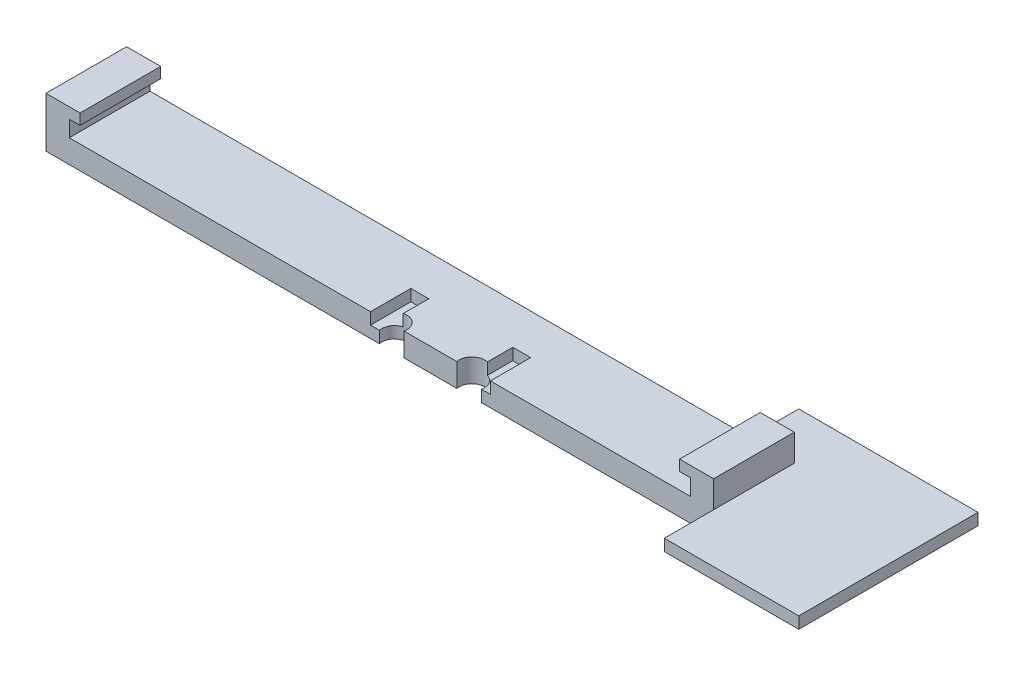
ISO-10303-21;
HEADER;
FILE_DESCRIPTION(('STEP AP214'),'2;1');
FILE_NAME('part.step','',(''),(''),'','','');
FILE_SCHEMA(('AUTOMOTIVE_DESIGN { 1 0 10303 214 1 1 1 1 }'));
ENDSEC;
DATA;
#1=APPLICATION_CONTEXT('core data for automotive mechanical design processes');
#2=APPLICATION_PROTOCOL_DEFINITION('international standard','automotive_design',2000,#1);
#3=PRODUCT_CONTEXT('',#1,'mechanical');
#4=PRODUCT('Part','Part','',(#3));
#5=PRODUCT_RELATED_PRODUCT_CATEGORY('part','',(#4));
#6=PRODUCT_DEFINITION_FORMATION('','',#4);
#7=PRODUCT_DEFINITION_CONTEXT('part definition',#1,'design');
#8=PRODUCT_DEFINITION('design','',#6,#7);
#9=PRODUCT_DEFINITION_SHAPE('','',#8);
#10=(LENGTH_UNIT() NAMED_UNIT(*) SI_UNIT(.MILLI.,.METRE.));
#11=(NAMED_UNIT(*) PLANE_ANGLE_UNIT() SI_UNIT($,.RADIAN.));
#12=(NAMED_UNIT(*) SI_UNIT($,.STERADIAN.) SOLID_ANGLE_UNIT());
#13=UNCERTAINTY_MEASURE_WITH_UNIT(LENGTH_MEASURE(1.E-05),#10,'distance_accuracy_value','');
#14=(GEOMETRIC_REPRESENTATION_CONTEXT(3) GLOBAL_UNCERTAINTY_ASSIGNED_CONTEXT((#13)) GLOBAL_UNIT_ASSIGNED_CONTEXT((#10,
#11,#12)) REPRESENTATION_CONTEXT('',''));
#15=CARTESIAN_POINT('',(0.,0.,0.));
#16=DIRECTION('',(0.,0.,1.));
#17=DIRECTION('',(1.,0.,0.));
#18=AXIS2_PLACEMENT_3D('',#15,#16,#17);
#19=CARTESIAN_POINT('',(0.,3.302,-11.43));
#20=DIRECTION('',(0.,0.,1.));
#21=DIRECTION('',(1.,0.,0.));
#22=AXIS2_PLACEMENT_3D('',#19,#20,#21);
#23=PLANE('',#22);
#24=DIRECTION('',(0.,1.,0.));
#25=VECTOR('',#24,1.);
#26=CARTESIAN_POINT('',(-3.048,1.651,-11.43));
#27=LINE('',#26,#25);
#28=CARTESIAN_POINT('',(-3.048,1.651,-11.43));
#29=VERTEX_POINT('',#28);
#30=CARTESIAN_POINT('',(-3.048,3.302,-11.43));
#31=VERTEX_POINT('',#30);
#32=EDGE_CURVE('E56',#29,#31,#27,.T.);
#33=ORIENTED_EDGE('',*,*,#32,.F.);
#34=DIRECTION('',(-1.,0.,0.));
#35=VECTOR('',#34,1.);
#36=CARTESIAN_POINT('',(0.,1.651,-11.43));
#37=LINE('',#36,#35);
#38=CARTESIAN_POINT('',(3.302,1.651,-11.43));
#39=VERTEX_POINT('',#38);
#40=EDGE_CURVE('E250',#39,#29,#37,.T.);
#41=ORIENTED_EDGE('',*,*,#40,.F.);
#42=DIRECTION('',(0.,1.,0.));
#43=VECTOR('',#42,1.);
#44=CARTESIAN_POINT('',(3.302,0.,-11.43));
#45=LINE('',#44,#43);
#46=CARTESIAN_POINT('',(3.302,0.,-11.43));
#47=VERTEX_POINT('',#46);
#48=EDGE_CURVE('E418',#47,#39,#45,.T.);
#49=ORIENTED_EDGE('',*,*,#48,.F.);
#50=DIRECTION('',(-1.,0.,0.));
#51=VECTOR('',#50,1.);
#52=CARTESIAN_POINT('',(0.,0.,-11.43));
#53=LINE('',#52,#51);
#54=CARTESIAN_POINT('',(-91.313,0.,-11.43));
#55=VERTEX_POINT('',#54);
#56=EDGE_CURVE('E455',#47,#55,#53,.T.);
#57=ORIENTED_EDGE('',*,*,#56,.T.);
#58=DIRECTION('',(0.,-1.,0.));
#59=VECTOR('',#58,1.);
#60=CARTESIAN_POINT('',(-91.313,0.,-11.43));
#61=LINE('',#60,#59);
#62=CARTESIAN_POINT('',(-91.313,7.112,-11.43));
#63=VERTEX_POINT('',#62);
#64=EDGE_CURVE('E391',#63,#55,#61,.T.);
#65=ORIENTED_EDGE('',*,*,#64,.F.);
#66=DIRECTION('',(1.,0.,0.));
#67=VECTOR('',#66,1.);
#68=CARTESIAN_POINT('',(-91.313,7.112,-11.43));
#69=LINE('',#68,#67);
#70=CARTESIAN_POINT('',(-86.487,7.112,-11.43));
#71=VERTEX_POINT('',#70);
#72=EDGE_CURVE('E402',#63,#71,#69,.T.);
#73=ORIENTED_EDGE('',*,*,#72,.T.);
#74=DIRECTION('',(0.,1.,0.));
#75=VECTOR('',#74,1.);
#76=CARTESIAN_POINT('',(-86.487,5.588,-11.43));
#77=LINE('',#76,#75);
#78=CARTESIAN_POINT('',(-86.487,5.588,-11.43));
#79=VERTEX_POINT('',#78);
#80=EDGE_CURVE('E385',#79,#71,#77,.T.);
#81=ORIENTED_EDGE('',*,*,#80,.F.);
#82=DIRECTION('',(-1.,0.,0.));
#83=VECTOR('',#82,1.);
#84=CARTESIAN_POINT('',(-88.011,5.588,-11.43));
#85=LINE('',#84,#83);
#86=CARTESIAN_POINT('',(-88.011,5.588,-11.43));
#87=VERTEX_POINT('',#86);
#88=EDGE_CURVE('E379',#79,#87,#85,.T.);
#89=ORIENTED_EDGE('',*,*,#88,.T.);
#90=DIRECTION('',(0.,-1.,0.));
#91=VECTOR('',#90,1.);
#92=CARTESIAN_POINT('',(-88.011,0.,-11.43));
#93=LINE('',#92,#91);
#94=CARTESIAN_POINT('',(-88.011,3.302,-11.43));
#95=VERTEX_POINT('',#94);
#96=EDGE_CURVE('E388',#87,#95,#93,.T.);
#97=ORIENTED_EDGE('',*,*,#96,.T.);
#98=DIRECTION('',(-1.,0.,0.));
#99=VECTOR('',#98,1.);
#100=CARTESIAN_POINT('',(0.,3.302,-11.43));
#101=LINE('',#100,#99);
#102=EDGE_CURVE('E61',#31,#95,#101,.T.);
#103=ORIENTED_EDGE('',*,*,#102,.F.);
#104=EDGE_LOOP('',(#33,#41,#49,#57,#65,#73,#81,#89,#97,#103));
#105=FACE_BOUND('',#104,.T.);
#106=ADVANCED_FACE('F41',(#105),#23,.F.);
#107=DIRECTION('',(-1.,0.,0.));
#108=VECTOR('',#107,1.);
#109=CARTESIAN_POINT('',(0.,3.302,-11.43));
#110=LINE('',#109,#108);
#111=CARTESIAN_POINT('',(3.302,3.302,-11.43));
#112=VERTEX_POINT('',#111);
#113=CARTESIAN_POINT('',(0.,3.302,-11.43));
#114=VERTEX_POINT('',#113);
#115=EDGE_CURVE('E274',#112,#114,#110,.T.);
#116=ORIENTED_EDGE('',*,*,#115,.T.);
#117=DIRECTION('',(0.,1.,0.));
#118=VECTOR('',#117,1.);
#119=CARTESIAN_POINT('',(0.,0.,-11.43));
#120=LINE('',#119,#118);
#121=CARTESIAN_POINT('',(0.,5.588,-11.43));
#122=VERTEX_POINT('',#121);
#123=EDGE_CURVE('E425',#114,#122,#120,.T.);
#124=ORIENTED_EDGE('',*,*,#123,.T.);
#125=DIRECTION('',(-1.,0.,0.));
#126=VECTOR('',#125,1.);
#127=CARTESIAN_POINT('',(0.,5.588,-11.43));
#128=LINE('',#127,#126);
#129=CARTESIAN_POINT('',(-1.524,5.588,-11.43));
#130=VERTEX_POINT('',#129);
#131=EDGE_CURVE('E352',#122,#130,#128,.T.);
#132=ORIENTED_EDGE('',*,*,#131,.T.);
#133=DIRECTION('',(0.,1.,0.));
#134=VECTOR('',#133,1.);
#135=CARTESIAN_POINT('',(-1.524,5.588,-11.43));
#136=LINE('',#135,#134);
#137=CARTESIAN_POINT('',(-1.524,7.112,-11.43));
#138=VERTEX_POINT('',#137);
#139=EDGE_CURVE('E361',#130,#138,#136,.T.);
#140=ORIENTED_EDGE('',*,*,#139,.T.);
#141=DIRECTION('',(-1.,0.,0.));
#142=VECTOR('',#141,1.);
#143=CARTESIAN_POINT('',(3.302,7.112,-11.43));
#144=LINE('',#143,#142);
#145=CARTESIAN_POINT('',(3.302,7.112,-11.43));
#146=VERTEX_POINT('',#145);
#147=EDGE_CURVE('E429',#146,#138,#144,.T.);
#148=ORIENTED_EDGE('',*,*,#147,.F.);
#149=EDGE_CURVE('E417',#112,#146,#45,.T.);
#150=ORIENTED_EDGE('',*,*,#149,.F.);
#151=EDGE_LOOP('',(#116,#124,#132,#140,#148,#150));
#152=FACE_BOUND('',#151,.T.);
#153=ADVANCED_FACE('F569',(#152),#23,.F.);
#154=CARTESIAN_POINT('',(3.302,0.,0.));
#155=DIRECTION('',(-1.,0.,0.));
#156=DIRECTION('',(0.,0.,1.));
#157=AXIS2_PLACEMENT_3D('',#154,#155,#156);
#158=PLANE('',#157);
#159=DIRECTION('',(0.,0.,1.));
#160=VECTOR('',#159,1.);
#161=CARTESIAN_POINT('',(3.302,3.302,0.));
#162=LINE('',#161,#160);
#163=CARTESIAN_POINT('',(3.302,3.302,0.));
#164=VERTEX_POINT('',#163);
#165=EDGE_CURVE('E49',#112,#164,#162,.T.);
#166=ORIENTED_EDGE('',*,*,#165,.F.);
#167=ORIENTED_EDGE('',*,*,#149,.T.);
#168=DIRECTION('',(0.,0.,1.));
#169=VECTOR('',#168,1.);
#170=CARTESIAN_POINT('',(3.302,7.112,0.));
#171=LINE('',#170,#169);
#172=CARTESIAN_POINT('',(3.302,7.112,0.));
#173=VERTEX_POINT('',#172);
#174=EDGE_CURVE('E421',#146,#173,#171,.T.);
#175=ORIENTED_EDGE('',*,*,#174,.T.);
#176=DIRECTION('',(0.,-1.,0.));
#177=VECTOR('',#176,1.);
#178=CARTESIAN_POINT('',(3.302,0.,0.));
#179=LINE('',#178,#177);
#180=EDGE_CURVE('E410',#173,#164,#179,.T.);
#181=ORIENTED_EDGE('',*,*,#180,.T.);
#182=EDGE_LOOP('',(#166,#167,#175,#181));
#183=FACE_BOUND('',#182,.T.);
#184=ADVANCED_FACE('F572',(#183),#158,.F.);
#185=CARTESIAN_POINT('',(0.,0.,0.));
#186=DIRECTION('',(-1.,0.,0.));
#187=DIRECTION('',(0.,0.,1.));
#188=AXIS2_PLACEMENT_3D('',#185,#186,#187);
#189=PLANE('',#188);
#190=DIRECTION('',(0.,-1.,0.));
#191=VECTOR('',#190,1.);
#192=CARTESIAN_POINT('',(0.,0.,0.));
#193=LINE('',#192,#191);
#194=CARTESIAN_POINT('',(0.,5.588,0.));
#195=VERTEX_POINT('',#194);
#196=CARTESIAN_POINT('',(0.,3.302,0.));
#197=VERTEX_POINT('',#196);
#198=EDGE_CURVE('E409',#195,#197,#193,.T.);
#199=ORIENTED_EDGE('',*,*,#198,.F.);
#200=DIRECTION('',(0.,0.,-1.));
#201=VECTOR('',#200,1.);
#202=CARTESIAN_POINT('',(0.,5.588,0.));
#203=LINE('',#202,#201);
#204=EDGE_CURVE('E349',#195,#122,#203,.T.);
#205=ORIENTED_EDGE('',*,*,#204,.T.);
#206=ORIENTED_EDGE('',*,*,#123,.F.);
#207=DIRECTION('',(0.,0.,-1.));
#208=VECTOR('',#207,1.);
#209=CARTESIAN_POINT('',(0.,3.302,0.));
#210=LINE('',#209,#208);
#211=EDGE_CURVE('E438',#197,#114,#210,.T.);
#212=ORIENTED_EDGE('',*,*,#211,.F.);
#213=EDGE_LOOP('',(#199,#205,#206,#212));
#214=FACE_BOUND('',#213,.T.);
#215=ADVANCED_FACE('F567',(#214),#189,.T.);
#216=CARTESIAN_POINT('',(-31.3436,3.302,-0.38099999999999));
#217=DIRECTION('',(0.,-1.,0.));
#218=DIRECTION('',(0.,0.,-1.));
#219=AXIS2_PLACEMENT_3D('',#216,#217,#218);
#220=CYLINDRICAL_SURFACE('',#219,1.778);
#221=DIRECTION('',(0.,-1.,0.));
#222=VECTOR('',#221,1.);
#223=CARTESIAN_POINT('',(-30.8769011199405,3.302,-2.09665618797915));
#224=LINE('',#223,#222);
#225=CARTESIAN_POINT('',(-30.8769011199405,3.302,-2.09665618797915));
#226=VERTEX_POINT('',#225);
#227=CARTESIAN_POINT('',(-30.8769011199405,1.651,-2.09665618797915));
#228=VERTEX_POINT('',#227);
#229=EDGE_CURVE('E313',#226,#228,#224,.T.);
#230=ORIENTED_EDGE('',*,*,#229,.F.);
#231=CARTESIAN_POINT('',(-31.3436,3.302,-0.38099999999999));
#232=DIRECTION('',(0.,1.,0.));
#233=DIRECTION('',(0.,0.,1.));
#234=AXIS2_PLACEMENT_3D('',#231,#232,#233);
#235=CIRCLE('',#234,1.778);
#236=CARTESIAN_POINT('',(-33.0802988800595,3.302,0.));
#237=VERTEX_POINT('',#236);
#238=EDGE_CURVE('E432',#226,#237,#235,.T.);
#239=ORIENTED_EDGE('',*,*,#238,.T.);
#240=DIRECTION('',(0.,-1.,0.));
#241=VECTOR('',#240,1.);
#242=CARTESIAN_POINT('',(-33.0802988800595,3.302,0.));
#243=LINE('',#242,#241);
#244=CARTESIAN_POINT('',(-33.0802988800595,0.,0.));
#245=VERTEX_POINT('',#244);
#246=EDGE_CURVE('E461',#237,#245,#243,.T.);
#247=ORIENTED_EDGE('',*,*,#246,.T.);
#248=CARTESIAN_POINT('',(-31.3436,0.,-0.38099999999999));
#249=DIRECTION('',(0.,1.,0.));
#250=DIRECTION('',(0.,0.,1.));
#251=AXIS2_PLACEMENT_3D('',#248,#249,#250);
#252=CIRCLE('',#251,1.778);
#253=CARTESIAN_POINT('',(-29.6069011199405,0.,0.));
#254=VERTEX_POINT('',#253);
#255=EDGE_CURVE('E431',#254,#245,#252,.T.);
#256=ORIENTED_EDGE('',*,*,#255,.F.);
#257=DIRECTION('',(0.,-1.,0.));
#258=VECTOR('',#257,1.);
#259=CARTESIAN_POINT('',(-29.6069011199405,3.302,0.));
#260=LINE('',#259,#258);
#261=CARTESIAN_POINT('',(-29.6069011199405,1.651,0.));
#262=VERTEX_POINT('',#261);
#263=EDGE_CURVE('E467',#262,#254,#260,.T.);
#264=ORIENTED_EDGE('',*,*,#263,.F.);
#265=CARTESIAN_POINT('',(-31.3436,1.651,-0.38099999999999));
#266=DIRECTION('',(0.,1.,0.));
#267=DIRECTION('',(0.,0.,1.));
#268=AXIS2_PLACEMENT_3D('',#265,#266,#267);
#269=CIRCLE('',#268,1.778);
#270=EDGE_CURVE('E345',#262,#228,#269,.T.);
#271=ORIENTED_EDGE('',*,*,#270,.T.);
#272=EDGE_LOOP('',(#230,#239,#247,#256,#264,#271));
#273=FACE_BOUND('',#272,.T.);
#274=ADVANCED_FACE('F43',(#273),#220,.F.);
#275=CARTESIAN_POINT('',(0.,3.302,0.));
#276=DIRECTION('',(0.,0.,1.));
#277=DIRECTION('',(1.,0.,0.));
#278=AXIS2_PLACEMENT_3D('',#275,#276,#277);
#279=PLANE('',#278);
#280=DIRECTION('',(0.,1.,0.));
#281=VECTOR('',#280,1.);
#282=CARTESIAN_POINT('',(-28.3369011199405,1.651,0.));
#283=LINE('',#282,#281);
#284=CARTESIAN_POINT('',(-28.3369011199405,1.651,0.));
#285=VERTEX_POINT('',#284);
#286=CARTESIAN_POINT('',(-28.3369011199405,3.302,0.));
#287=VERTEX_POINT('',#286);
#288=EDGE_CURVE('E331',#285,#287,#283,.T.);
#289=ORIENTED_EDGE('',*,*,#288,.F.);
#290=DIRECTION('',(1.,0.,0.));
#291=VECTOR('',#290,1.);
#292=CARTESIAN_POINT('',(-30.8769011199405,1.651,0.));
#293=LINE('',#292,#291);
#294=EDGE_CURVE('E322',#262,#285,#293,.T.);
#295=ORIENTED_EDGE('',*,*,#294,.F.);
#296=ORIENTED_EDGE('',*,*,#263,.T.);
#297=DIRECTION('',(-1.,0.,0.));
#298=VECTOR('',#297,1.);
#299=CARTESIAN_POINT('',(0.,0.,0.));
#300=LINE('',#299,#298);
#301=CARTESIAN_POINT('',(3.302,0.,0.));
#302=VERTEX_POINT('',#301);
#303=EDGE_CURVE('E452',#302,#254,#300,.T.);
#304=ORIENTED_EDGE('',*,*,#303,.F.);
#305=CARTESIAN_POINT('',(3.302,1.651,0.));
#306=VERTEX_POINT('',#305);
#307=EDGE_CURVE('E414',#306,#302,#179,.T.);
#308=ORIENTED_EDGE('',*,*,#307,.F.);
#309=EDGE_CURVE('E413',#164,#306,#179,.T.);
#310=ORIENTED_EDGE('',*,*,#309,.F.);
#311=ORIENTED_EDGE('',*,*,#180,.F.);
#312=DIRECTION('',(-1.,0.,0.));
#313=VECTOR('',#312,1.);
#314=CARTESIAN_POINT('',(3.302,7.112,0.));
#315=LINE('',#314,#313);
#316=CARTESIAN_POINT('',(-1.524,7.112,0.));
#317=VERTEX_POINT('',#316);
#318=EDGE_CURVE('E423',#173,#317,#315,.T.);
#319=ORIENTED_EDGE('',*,*,#318,.T.);
#320=DIRECTION('',(0.,1.,0.));
#321=VECTOR('',#320,1.);
#322=CARTESIAN_POINT('',(-1.524,5.588,0.));
#323=LINE('',#322,#321);
#324=CARTESIAN_POINT('',(-1.524,5.588,0.));
#325=VERTEX_POINT('',#324);
#326=EDGE_CURVE('E364',#325,#317,#323,.T.);
#327=ORIENTED_EDGE('',*,*,#326,.F.);
#328=DIRECTION('',(1.,0.,0.));
#329=VECTOR('',#328,1.);
#330=CARTESIAN_POINT('',(0.,5.588,0.));
#331=LINE('',#330,#329);
#332=EDGE_CURVE('E358',#325,#195,#331,.T.);
#333=ORIENTED_EDGE('',*,*,#332,.T.);
#334=ORIENTED_EDGE('',*,*,#198,.T.);
#335=DIRECTION('',(-1.,0.,0.));
#336=VECTOR('',#335,1.);
#337=CARTESIAN_POINT('',(0.,3.302,0.));
#338=LINE('',#337,#336);
#339=EDGE_CURVE('E434',#197,#287,#338,.T.);
#340=ORIENTED_EDGE('',*,*,#339,.T.);
#341=EDGE_LOOP('',(#289,#295,#296,#304,#308,#310,#311,#319,#327,#333,#334,#340));
#342=FACE_BOUND('',#341,.T.);
#343=ADVANCED_FACE('F544',(#342),#279,.T.);
#344=DIRECTION('',(0.,1.,0.));
#345=VECTOR('',#344,1.);
#346=CARTESIAN_POINT('',(-45.3230988800595,1.651,0.));
#347=LINE('',#346,#345);
#348=CARTESIAN_POINT('',(-45.3230988800595,1.651,0.));
#349=VERTEX_POINT('',#348);
#350=CARTESIAN_POINT('',(-45.3230988800595,3.302,0.));
#351=VERTEX_POINT('',#350);
#352=EDGE_CURVE('E305',#349,#351,#347,.T.);
#353=ORIENTED_EDGE('',*,*,#352,.T.);
#354=CARTESIAN_POINT('',(-88.011,3.302,0.));
#355=VERTEX_POINT('',#354);
#356=EDGE_CURVE('E439',#351,#355,#338,.T.);
#357=ORIENTED_EDGE('',*,*,#356,.T.);
#358=DIRECTION('',(0.,1.,0.));
#359=VECTOR('',#358,1.);
#360=CARTESIAN_POINT('',(-88.011,0.,0.));
#361=LINE('',#360,#359);
#362=CARTESIAN_POINT('',(-88.011,5.588,0.));
#363=VERTEX_POINT('',#362);
#364=EDGE_CURVE('E395',#355,#363,#361,.T.);
#365=ORIENTED_EDGE('',*,*,#364,.T.);
#366=DIRECTION('',(1.,0.,0.));
#367=VECTOR('',#366,1.);
#368=CARTESIAN_POINT('',(-88.011,5.588,0.));
#369=LINE('',#368,#367);
#370=CARTESIAN_POINT('',(-86.487,5.588,0.));
#371=VERTEX_POINT('',#370);
#372=EDGE_CURVE('E373',#363,#371,#369,.T.);
#373=ORIENTED_EDGE('',*,*,#372,.T.);
#374=DIRECTION('',(0.,1.,0.));
#375=VECTOR('',#374,1.);
#376=CARTESIAN_POINT('',(-86.487,5.588,0.));
#377=LINE('',#376,#375);
#378=CARTESIAN_POINT('',(-86.487,7.112,0.));
#379=VERTEX_POINT('',#378);
#380=EDGE_CURVE('E382',#371,#379,#377,.T.);
#381=ORIENTED_EDGE('',*,*,#380,.T.);
#382=DIRECTION('',(1.,0.,0.));
#383=VECTOR('',#382,1.);
#384=CARTESIAN_POINT('',(-91.313,7.112,0.));
#385=LINE('',#384,#383);
#386=CARTESIAN_POINT('',(-91.313,7.112,0.));
#387=VERTEX_POINT('',#386);
#388=EDGE_CURVE('E407',#387,#379,#385,.T.);
#389=ORIENTED_EDGE('',*,*,#388,.F.);
#390=DIRECTION('',(0.,1.,0.));
#391=VECTOR('',#390,1.);
#392=CARTESIAN_POINT('',(-91.313,0.,0.));
#393=LINE('',#392,#391);
#394=CARTESIAN_POINT('',(-91.313,0.,0.));
#395=VERTEX_POINT('',#394);
#396=EDGE_CURVE('E398',#395,#387,#393,.T.);
#397=ORIENTED_EDGE('',*,*,#396,.F.);
#398=CARTESIAN_POINT('',(-44.0530988800595,0.,0.));
#399=VERTEX_POINT('',#398);
#400=EDGE_CURVE('E456',#399,#395,#300,.T.);
#401=ORIENTED_EDGE('',*,*,#400,.F.);
#402=DIRECTION('',(0.,-1.,0.));
#403=VECTOR('',#402,1.);
#404=CARTESIAN_POINT('',(-44.0530988800595,3.302,0.));
#405=LINE('',#404,#403);
#406=CARTESIAN_POINT('',(-44.0530988800595,1.651,0.));
#407=VERTEX_POINT('',#406);
#408=EDGE_CURVE('E465',#407,#399,#405,.T.);
#409=ORIENTED_EDGE('',*,*,#408,.F.);
#410=DIRECTION('',(1.,0.,0.));
#411=VECTOR('',#410,1.);
#412=CARTESIAN_POINT('',(-45.3230988800595,1.651,0.));
#413=LINE('',#412,#411);
#414=EDGE_CURVE('E297',#349,#407,#413,.T.);
#415=ORIENTED_EDGE('',*,*,#414,.F.);
#416=EDGE_LOOP('',(#353,#357,#365,#373,#381,#389,#397,#401,#409,#415));
#417=FACE_BOUND('',#416,.T.);
#418=ADVANCED_FACE('F501',(#417),#279,.T.);
#419=CARTESIAN_POINT('',(-42.3164,3.302,-0.38099999999999));
#420=DIRECTION('',(0.,-1.,0.));
#421=DIRECTION('',(0.,0.,-1.));
#422=AXIS2_PLACEMENT_3D('',#419,#420,#421);
#423=CYLINDRICAL_SURFACE('',#422,1.77800000000001);
#424=DIRECTION('',(0.,-1.,0.));
#425=VECTOR('',#424,1.);
#426=CARTESIAN_POINT('',(-42.7830988800595,3.302,-2.09665618797916));
#427=LINE('',#426,#425);
#428=CARTESIAN_POINT('',(-42.7830988800595,1.651,-2.09665618797916));
#429=VERTEX_POINT('',#428);
#430=CARTESIAN_POINT('',(-42.7830988800595,3.302,-2.09665618797916));
#431=VERTEX_POINT('',#430);
#432=EDGE_CURVE('E343',#429,#431,#427,.F.);
#433=ORIENTED_EDGE('',*,*,#432,.F.);
#434=CARTESIAN_POINT('',(-42.3164,1.651,-0.38099999999999));
#435=DIRECTION('',(0.,-1.,0.));
#436=DIRECTION('',(0.,0.,-1.));
#437=AXIS2_PLACEMENT_3D('',#434,#435,#436);
#438=CIRCLE('',#437,1.77800000000001);
#439=EDGE_CURVE('E471',#407,#429,#438,.T.);
#440=ORIENTED_EDGE('',*,*,#439,.F.);
#441=ORIENTED_EDGE('',*,*,#408,.T.);
#442=CARTESIAN_POINT('',(-42.3164,0.,-0.38099999999999));
#443=DIRECTION('',(0.,1.,0.));
#444=DIRECTION('',(0.,0.,1.));
#445=AXIS2_PLACEMENT_3D('',#442,#443,#444);
#446=CIRCLE('',#445,1.77800000000001);
#447=CARTESIAN_POINT('',(-40.5797011199405,0.,0.));
#448=VERTEX_POINT('',#447);
#449=EDGE_CURVE('E458',#448,#399,#446,.T.);
#450=ORIENTED_EDGE('',*,*,#449,.F.);
#451=DIRECTION('',(0.,-1.,0.));
#452=VECTOR('',#451,1.);
#453=CARTESIAN_POINT('',(-40.5797011199405,3.302,0.));
#454=LINE('',#453,#452);
#455=CARTESIAN_POINT('',(-40.5797011199405,3.302,0.));
#456=VERTEX_POINT('',#455);
#457=EDGE_CURVE('E463',#456,#448,#454,.T.);
#458=ORIENTED_EDGE('',*,*,#457,.F.);
#459=CARTESIAN_POINT('',(-42.3164,3.302,-0.38099999999999));
#460=DIRECTION('',(0.,1.,0.));
#461=DIRECTION('',(0.,0.,1.));
#462=AXIS2_PLACEMENT_3D('',#459,#460,#461);
#463=CIRCLE('',#462,1.77800000000001);
#464=EDGE_CURVE('E447',#456,#431,#463,.T.);
#465=ORIENTED_EDGE('',*,*,#464,.T.);
#466=EDGE_LOOP('',(#433,#440,#441,#450,#458,#465));
#467=FACE_BOUND('',#466,.T.);
#468=ADVANCED_FACE('F517',(#467),#423,.F.);
#469=EDGE_CURVE('E435',#245,#448,#300,.T.);
#470=ORIENTED_EDGE('',*,*,#469,.F.);
#471=ORIENTED_EDGE('',*,*,#246,.F.);
#472=EDGE_CURVE('E440',#237,#456,#338,.T.);
#473=ORIENTED_EDGE('',*,*,#472,.T.);
#474=ORIENTED_EDGE('',*,*,#457,.T.);
#475=EDGE_LOOP('',(#470,#471,#473,#474));
#476=FACE_BOUND('',#475,.T.);
#477=ADVANCED_FACE('F508',(#476),#279,.T.);
#478=CARTESIAN_POINT('',(0.,3.302,0.));
#479=DIRECTION('',(0.,1.,0.));
#480=DIRECTION('',(0.,0.,1.));
#481=AXIS2_PLACEMENT_3D('',#478,#479,#480);
#482=PLANE('',#481);
#483=DIRECTION('',(0.,0.,1.));
#484=VECTOR('',#483,1.);
#485=CARTESIAN_POINT('',(-45.3230988800595,3.302,0.));
#486=LINE('',#485,#484);
#487=CARTESIAN_POINT('',(-45.3230988800595,3.302,-5.71499999999999));
#488=VERTEX_POINT('',#487);
#489=EDGE_CURVE('E306',#488,#351,#486,.T.);
#490=ORIENTED_EDGE('',*,*,#489,.F.);
#491=DIRECTION('',(-1.,0.,0.));
#492=VECTOR('',#491,1.);
#493=CARTESIAN_POINT('',(-45.3230988800595,3.302,-5.71499999999999));
#494=LINE('',#493,#492);
#495=CARTESIAN_POINT('',(-42.7830988800595,3.302,-5.71499999999999));
#496=VERTEX_POINT('',#495);
#497=EDGE_CURVE('E298',#496,#488,#494,.T.);
#498=ORIENTED_EDGE('',*,*,#497,.F.);
#499=DIRECTION('',(0.,0.,-1.));
#500=VECTOR('',#499,1.);
#501=CARTESIAN_POINT('',(-42.7830988800595,3.302,0.));
#502=LINE('',#501,#500);
#503=EDGE_CURVE('E469',#431,#496,#502,.T.);
#504=ORIENTED_EDGE('',*,*,#503,.F.);
#505=ORIENTED_EDGE('',*,*,#464,.F.);
#506=ORIENTED_EDGE('',*,*,#472,.F.);
#507=ORIENTED_EDGE('',*,*,#238,.F.);
#508=DIRECTION('',(0.,0.,1.));
#509=VECTOR('',#508,1.);
#510=CARTESIAN_POINT('',(-30.8769011199405,3.302,-5.715));
#511=LINE('',#510,#509);
#512=CARTESIAN_POINT('',(-30.8769011199405,3.302,-5.715));
#513=VERTEX_POINT('',#512);
#514=EDGE_CURVE('E293',#513,#226,#511,.T.);
#515=ORIENTED_EDGE('',*,*,#514,.F.);
#516=DIRECTION('',(-1.,0.,0.));
#517=VECTOR('',#516,1.);
#518=CARTESIAN_POINT('',(-30.8769011199405,3.302,-5.715));
#519=LINE('',#518,#517);
#520=CARTESIAN_POINT('',(-28.3369011199405,3.302,-5.715));
#521=VERTEX_POINT('',#520);
#522=EDGE_CURVE('E323',#521,#513,#519,.T.);
#523=ORIENTED_EDGE('',*,*,#522,.F.);
#524=DIRECTION('',(0.,0.,-1.));
#525=VECTOR('',#524,1.);
#526=CARTESIAN_POINT('',(-28.3369011199405,3.302,-5.715));
#527=LINE('',#526,#525);
#528=EDGE_CURVE('E333',#287,#521,#527,.T.);
#529=ORIENTED_EDGE('',*,*,#528,.F.);
#530=ORIENTED_EDGE('',*,*,#339,.F.);
#531=ORIENTED_EDGE('',*,*,#211,.T.);
#532=ORIENTED_EDGE('',*,*,#115,.F.);
#533=ORIENTED_EDGE('',*,*,#165,.T.);
#534=DIRECTION('',(0.,0.,-1.));
#535=VECTOR('',#534,1.);
#536=CARTESIAN_POINT('',(3.302,3.302,0.));
#537=LINE('',#536,#535);
#538=CARTESIAN_POINT('',(3.302,3.302,6.985));
#539=VERTEX_POINT('',#538);
#540=EDGE_CURVE('E284',#539,#164,#537,.T.);
#541=ORIENTED_EDGE('',*,*,#540,.F.);
#542=DIRECTION('',(-1.,0.,0.));
#543=VECTOR('',#542,1.);
#544=CARTESIAN_POINT('',(0.,3.302,6.985));
#545=LINE('',#544,#543);
#546=CARTESIAN_POINT('',(22.352,3.302,6.985));
#547=VERTEX_POINT('',#546);
#548=EDGE_CURVE('E282',#547,#539,#545,.T.);
#549=ORIENTED_EDGE('',*,*,#548,.F.);
#550=DIRECTION('',(0.,0.,-1.));
#551=VECTOR('',#550,1.);
#552=CARTESIAN_POINT('',(22.352,3.302,0.));
#553=LINE('',#552,#551);
#554=CARTESIAN_POINT('',(22.352,3.302,-18.415));
#555=VERTEX_POINT('',#554);
#556=EDGE_CURVE('E279',#547,#555,#553,.T.);
#557=ORIENTED_EDGE('',*,*,#556,.T.);
#558=DIRECTION('',(-1.,0.,0.));
#559=VECTOR('',#558,1.);
#560=CARTESIAN_POINT('',(0.,3.302,-18.415));
#561=LINE('',#560,#559);
#562=CARTESIAN_POINT('',(-3.048,3.302,-18.415));
#563=VERTEX_POINT('',#562);
#564=EDGE_CURVE('E277',#555,#563,#561,.T.);
#565=ORIENTED_EDGE('',*,*,#564,.T.);
#566=DIRECTION('',(0.,0.,-1.));
#567=VECTOR('',#566,1.);
#568=CARTESIAN_POINT('',(-3.048,3.302,0.));
#569=LINE('',#568,#567);
#570=EDGE_CURVE('E256',#31,#563,#569,.T.);
#571=ORIENTED_EDGE('',*,*,#570,.F.);
#572=ORIENTED_EDGE('',*,*,#102,.T.);
#573=DIRECTION('',(0.,0.,-1.));
#574=VECTOR('',#573,1.);
#575=CARTESIAN_POINT('',(-88.011,3.302,0.));
#576=LINE('',#575,#574);
#577=EDGE_CURVE('E444',#355,#95,#576,.T.);
#578=ORIENTED_EDGE('',*,*,#577,.F.);
#579=ORIENTED_EDGE('',*,*,#356,.F.);
#580=EDGE_LOOP('',(#490,#498,#504,#505,#506,#507,#515,#523,#529,#530,#531,#532,#533,#541,#549,
#557,#565,#571,#572,#578,#579));
#581=FACE_BOUND('',#580,.T.);
#582=ADVANCED_FACE('F477',(#581),#482,.T.);
#583=CARTESIAN_POINT('',(0.,0.,0.));
#584=DIRECTION('',(0.,1.,0.));
#585=DIRECTION('',(0.,0.,1.));
#586=AXIS2_PLACEMENT_3D('',#583,#584,#585);
#587=PLANE('',#586);
#588=ORIENTED_EDGE('',*,*,#255,.T.);
#589=ORIENTED_EDGE('',*,*,#469,.T.);
#590=ORIENTED_EDGE('',*,*,#449,.T.);
#591=ORIENTED_EDGE('',*,*,#400,.T.);
#592=DIRECTION('',(0.,0.,1.));
#593=VECTOR('',#592,1.);
#594=CARTESIAN_POINT('',(-91.313,0.,-11.43));
#595=LINE('',#594,#593);
#596=EDGE_CURVE('E394',#55,#395,#595,.T.);
#597=ORIENTED_EDGE('',*,*,#596,.F.);
#598=ORIENTED_EDGE('',*,*,#56,.F.);
#599=DIRECTION('',(0.,0.,-1.));
#600=VECTOR('',#599,1.);
#601=CARTESIAN_POINT('',(3.302,0.,0.));
#602=LINE('',#601,#600);
#603=EDGE_CURVE('E412',#302,#47,#602,.T.);
#604=ORIENTED_EDGE('',*,*,#603,.F.);
#605=ORIENTED_EDGE('',*,*,#303,.T.);
#606=EDGE_LOOP('',(#588,#589,#590,#591,#597,#598,#604,#605));
#607=FACE_BOUND('',#606,.T.);
#608=ADVANCED_FACE('F523',(#607),#587,.F.);
#609=CARTESIAN_POINT('',(3.302,7.112,0.));
#610=DIRECTION('',(0.,-1.,0.));
#611=DIRECTION('',(0.,0.,-1.));
#612=AXIS2_PLACEMENT_3D('',#609,#610,#611);
#613=PLANE('',#612);
#614=ORIENTED_EDGE('',*,*,#147,.T.);
#615=DIRECTION('',(0.,0.,1.));
#616=VECTOR('',#615,1.);
#617=CARTESIAN_POINT('',(-1.524,7.112,0.));
#618=LINE('',#617,#616);
#619=EDGE_CURVE('E348',#138,#317,#618,.T.);
#620=ORIENTED_EDGE('',*,*,#619,.T.);
#621=ORIENTED_EDGE('',*,*,#318,.F.);
#622=ORIENTED_EDGE('',*,*,#174,.F.);
#623=EDGE_LOOP('',(#614,#620,#621,#622));
#624=FACE_BOUND('',#623,.T.);
#625=ADVANCED_FACE('F576',(#624),#613,.F.);
#626=ORIENTED_EDGE('',*,*,#48,.T.);
#627=DIRECTION('',(0.,0.,1.));
#628=VECTOR('',#627,1.);
#629=CARTESIAN_POINT('',(3.302,1.651,0.));
#630=LINE('',#629,#628);
#631=EDGE_CURVE('E11',#39,#306,#630,.T.);
#632=ORIENTED_EDGE('',*,*,#631,.T.);
#633=ORIENTED_EDGE('',*,*,#307,.T.);
#634=ORIENTED_EDGE('',*,*,#603,.T.);
#635=EDGE_LOOP('',(#626,#632,#633,#634));
#636=FACE_BOUND('',#635,.T.);
#637=ADVANCED_FACE('F539',(#636),#158,.F.);
#638=CARTESIAN_POINT('',(-91.313,7.112,-11.43));
#639=DIRECTION('',(0.,-1.,0.));
#640=DIRECTION('',(0.,0.,-1.));
#641=AXIS2_PLACEMENT_3D('',#638,#639,#640);
#642=PLANE('',#641);
#643=ORIENTED_EDGE('',*,*,#388,.T.);
#644=DIRECTION('',(0.,0.,-1.));
#645=VECTOR('',#644,1.);
#646=CARTESIAN_POINT('',(-86.487,7.112,0.));
#647=LINE('',#646,#645);
#648=EDGE_CURVE('E367',#379,#71,#647,.T.);
#649=ORIENTED_EDGE('',*,*,#648,.T.);
#650=ORIENTED_EDGE('',*,*,#72,.F.);
#651=DIRECTION('',(0.,0.,-1.));
#652=VECTOR('',#651,1.);
#653=CARTESIAN_POINT('',(-91.313,7.112,-11.43));
#654=LINE('',#653,#652);
#655=EDGE_CURVE('E400',#387,#63,#654,.T.);
#656=ORIENTED_EDGE('',*,*,#655,.F.);
#657=EDGE_LOOP('',(#643,#649,#650,#656));
#658=FACE_BOUND('',#657,.T.);
#659=ADVANCED_FACE('F535',(#658),#642,.F.);
#660=CARTESIAN_POINT('',(-91.313,0.,0.));
#661=DIRECTION('',(1.,0.,0.));
#662=DIRECTION('',(0.,0.,-1.));
#663=AXIS2_PLACEMENT_3D('',#660,#661,#662);
#664=PLANE('',#663);
#665=ORIENTED_EDGE('',*,*,#64,.T.);
#666=ORIENTED_EDGE('',*,*,#596,.T.);
#667=ORIENTED_EDGE('',*,*,#396,.T.);
#668=ORIENTED_EDGE('',*,*,#655,.T.);
#669=EDGE_LOOP('',(#665,#666,#667,#668));
#670=FACE_BOUND('',#669,.T.);
#671=ADVANCED_FACE('F528',(#670),#664,.F.);
#672=CARTESIAN_POINT('',(-88.011,0.,0.));
#673=DIRECTION('',(1.,0.,0.));
#674=DIRECTION('',(0.,0.,-1.));
#675=AXIS2_PLACEMENT_3D('',#672,#673,#674);
#676=PLANE('',#675);
#677=DIRECTION('',(0.,0.,1.));
#678=VECTOR('',#677,1.);
#679=CARTESIAN_POINT('',(-88.011,5.588,0.));
#680=LINE('',#679,#678);
#681=EDGE_CURVE('E370',#87,#363,#680,.T.);
#682=ORIENTED_EDGE('',*,*,#681,.T.);
#683=ORIENTED_EDGE('',*,*,#364,.F.);
#684=ORIENTED_EDGE('',*,*,#577,.T.);
#685=ORIENTED_EDGE('',*,*,#96,.F.);
#686=EDGE_LOOP('',(#682,#683,#684,#685));
#687=FACE_BOUND('',#686,.T.);
#688=ADVANCED_FACE('F499',(#687),#676,.T.);
#689=CARTESIAN_POINT('',(-86.487,5.588,0.));
#690=DIRECTION('',(1.,0.,0.));
#691=DIRECTION('',(0.,0.,-1.));
#692=AXIS2_PLACEMENT_3D('',#689,#690,#691);
#693=PLANE('',#692);
#694=ORIENTED_EDGE('',*,*,#648,.F.);
#695=ORIENTED_EDGE('',*,*,#380,.F.);
#696=DIRECTION('',(0.,0.,-1.));
#697=VECTOR('',#696,1.);
#698=CARTESIAN_POINT('',(-86.487,5.588,0.));
#699=LINE('',#698,#697);
#700=EDGE_CURVE('E376',#371,#79,#699,.T.);
#701=ORIENTED_EDGE('',*,*,#700,.T.);
#702=ORIENTED_EDGE('',*,*,#80,.T.);
#703=EDGE_LOOP('',(#694,#695,#701,#702));
#704=FACE_BOUND('',#703,.T.);
#705=ADVANCED_FACE('F616',(#704),#693,.T.);
#706=CARTESIAN_POINT('',(0.,5.588,0.));
#707=DIRECTION('',(0.,-1.,0.));
#708=DIRECTION('',(0.,0.,-1.));
#709=AXIS2_PLACEMENT_3D('',#706,#707,#708);
#710=PLANE('',#709);
#711=ORIENTED_EDGE('',*,*,#681,.F.);
#712=ORIENTED_EDGE('',*,*,#88,.F.);
#713=ORIENTED_EDGE('',*,*,#700,.F.);
#714=ORIENTED_EDGE('',*,*,#372,.F.);
#715=EDGE_LOOP('',(#711,#712,#713,#714));
#716=FACE_BOUND('',#715,.T.);
#717=ADVANCED_FACE('F590',(#716),#710,.T.);
#718=CARTESIAN_POINT('',(-1.524,5.588,0.));
#719=DIRECTION('',(-1.,0.,0.));
#720=DIRECTION('',(0.,0.,1.));
#721=AXIS2_PLACEMENT_3D('',#718,#719,#720);
#722=PLANE('',#721);
#723=ORIENTED_EDGE('',*,*,#619,.F.);
#724=ORIENTED_EDGE('',*,*,#139,.F.);
#725=DIRECTION('',(0.,0.,1.));
#726=VECTOR('',#725,1.);
#727=CARTESIAN_POINT('',(-1.524,5.588,0.));
#728=LINE('',#727,#726);
#729=EDGE_CURVE('E355',#130,#325,#728,.T.);
#730=ORIENTED_EDGE('',*,*,#729,.T.);
#731=ORIENTED_EDGE('',*,*,#326,.T.);
#732=EDGE_LOOP('',(#723,#724,#730,#731));
#733=FACE_BOUND('',#732,.T.);
#734=ADVANCED_FACE('F579',(#733),#722,.T.);
#735=CARTESIAN_POINT('',(0.,5.588,0.));
#736=DIRECTION('',(0.,1.,0.));
#737=DIRECTION('',(0.,0.,1.));
#738=AXIS2_PLACEMENT_3D('',#735,#736,#737);
#739=PLANE('',#738);
#740=ORIENTED_EDGE('',*,*,#204,.F.);
#741=ORIENTED_EDGE('',*,*,#332,.F.);
#742=ORIENTED_EDGE('',*,*,#729,.F.);
#743=ORIENTED_EDGE('',*,*,#131,.F.);
#744=EDGE_LOOP('',(#740,#741,#742,#743));
#745=FACE_BOUND('',#744,.T.);
#746=ADVANCED_FACE('F582',(#745),#739,.F.);
#747=CARTESIAN_POINT('',(-30.8769011199405,1.651,-5.715));
#748=DIRECTION('',(-1.,0.,0.));
#749=DIRECTION('',(0.,0.,1.));
#750=AXIS2_PLACEMENT_3D('',#747,#748,#749);
#751=PLANE('',#750);
#752=ORIENTED_EDGE('',*,*,#229,.T.);
#753=DIRECTION('',(0.,0.,1.));
#754=VECTOR('',#753,1.);
#755=CARTESIAN_POINT('',(-30.8769011199405,1.651,-5.715));
#756=LINE('',#755,#754);
#757=CARTESIAN_POINT('',(-30.8769011199405,1.651,-5.715));
#758=VERTEX_POINT('',#757);
#759=EDGE_CURVE('E319',#758,#228,#756,.T.);
#760=ORIENTED_EDGE('',*,*,#759,.F.);
#761=DIRECTION('',(0.,1.,0.));
#762=VECTOR('',#761,1.);
#763=CARTESIAN_POINT('',(-30.8769011199405,1.651,-5.715));
#764=LINE('',#763,#762);
#765=EDGE_CURVE('E308',#758,#513,#764,.T.);
#766=ORIENTED_EDGE('',*,*,#765,.T.);
#767=ORIENTED_EDGE('',*,*,#514,.T.);
#768=EDGE_LOOP('',(#752,#760,#766,#767));
#769=FACE_BOUND('',#768,.T.);
#770=ADVANCED_FACE('F551',(#769),#751,.F.);
#771=CARTESIAN_POINT('',(-30.8769011199405,1.651,-5.715));
#772=DIRECTION('',(0.,0.,-1.));
#773=DIRECTION('',(-1.,0.,0.));
#774=AXIS2_PLACEMENT_3D('',#771,#772,#773);
#775=PLANE('',#774);
#776=ORIENTED_EDGE('',*,*,#522,.T.);
#777=ORIENTED_EDGE('',*,*,#765,.F.);
#778=DIRECTION('',(-1.,0.,0.));
#779=VECTOR('',#778,1.);
#780=CARTESIAN_POINT('',(-30.8769011199405,1.651,-5.715));
#781=LINE('',#780,#779);
#782=CARTESIAN_POINT('',(-28.3369011199405,1.651,-5.715));
#783=VERTEX_POINT('',#782);
#784=EDGE_CURVE('E328',#783,#758,#781,.T.);
#785=ORIENTED_EDGE('',*,*,#784,.F.);
#786=DIRECTION('',(0.,1.,0.));
#787=VECTOR('',#786,1.);
#788=CARTESIAN_POINT('',(-28.3369011199405,1.651,-5.715));
#789=LINE('',#788,#787);
#790=EDGE_CURVE('E339',#783,#521,#789,.T.);
#791=ORIENTED_EDGE('',*,*,#790,.T.);
#792=EDGE_LOOP('',(#776,#777,#785,#791));
#793=FACE_BOUND('',#792,.T.);
#794=ADVANCED_FACE('F557',(#793),#775,.F.);
#795=CARTESIAN_POINT('',(-28.3369011199405,1.651,-5.715));
#796=DIRECTION('',(1.,0.,0.));
#797=DIRECTION('',(0.,0.,-1.));
#798=AXIS2_PLACEMENT_3D('',#795,#796,#797);
#799=PLANE('',#798);
#800=ORIENTED_EDGE('',*,*,#528,.T.);
#801=ORIENTED_EDGE('',*,*,#790,.F.);
#802=DIRECTION('',(0.,0.,-1.));
#803=VECTOR('',#802,1.);
#804=CARTESIAN_POINT('',(-28.3369011199405,1.651,-5.715));
#805=LINE('',#804,#803);
#806=EDGE_CURVE('E325',#285,#783,#805,.T.);
#807=ORIENTED_EDGE('',*,*,#806,.F.);
#808=ORIENTED_EDGE('',*,*,#288,.T.);
#809=EDGE_LOOP('',(#800,#801,#807,#808));
#810=FACE_BOUND('',#809,.T.);
#811=ADVANCED_FACE('F671',(#810),#799,.F.);
#812=CARTESIAN_POINT('',(0.,1.651,0.));
#813=DIRECTION('',(0.,1.,0.));
#814=DIRECTION('',(0.,0.,1.));
#815=AXIS2_PLACEMENT_3D('',#812,#813,#814);
#816=PLANE('',#815);
#817=ORIENTED_EDGE('',*,*,#294,.T.);
#818=ORIENTED_EDGE('',*,*,#806,.T.);
#819=ORIENTED_EDGE('',*,*,#784,.T.);
#820=ORIENTED_EDGE('',*,*,#759,.T.);
#821=ORIENTED_EDGE('',*,*,#270,.F.);
#822=EDGE_LOOP('',(#817,#818,#819,#820,#821));
#823=FACE_BOUND('',#822,.T.);
#824=ADVANCED_FACE('F553',(#823),#816,.T.);
#825=CARTESIAN_POINT('',(-45.3230988800595,1.651,0.));
#826=DIRECTION('',(-1.,0.,0.));
#827=DIRECTION('',(0.,0.,1.));
#828=AXIS2_PLACEMENT_3D('',#825,#826,#827);
#829=PLANE('',#828);
#830=ORIENTED_EDGE('',*,*,#489,.T.);
#831=ORIENTED_EDGE('',*,*,#352,.F.);
#832=DIRECTION('',(0.,0.,1.));
#833=VECTOR('',#832,1.);
#834=CARTESIAN_POINT('',(-45.3230988800595,1.651,0.));
#835=LINE('',#834,#833);
#836=CARTESIAN_POINT('',(-45.3230988800595,1.651,-5.71499999999999));
#837=VERTEX_POINT('',#836);
#838=EDGE_CURVE('E294',#837,#349,#835,.T.);
#839=ORIENTED_EDGE('',*,*,#838,.F.);
#840=DIRECTION('',(0.,1.,0.));
#841=VECTOR('',#840,1.);
#842=CARTESIAN_POINT('',(-45.3230988800595,1.651,-5.71499999999999));
#843=LINE('',#842,#841);
#844=EDGE_CURVE('E311',#837,#488,#843,.T.);
#845=ORIENTED_EDGE('',*,*,#844,.T.);
#846=EDGE_LOOP('',(#830,#831,#839,#845));
#847=FACE_BOUND('',#846,.T.);
#848=ADVANCED_FACE('F688',(#847),#829,.F.);
#849=CARTESIAN_POINT('',(-45.3230988800595,1.651,-5.71499999999999));
#850=DIRECTION('',(0.,0.,-1.));
#851=DIRECTION('',(-1.,0.,0.));
#852=AXIS2_PLACEMENT_3D('',#849,#850,#851);
#853=PLANE('',#852);
#854=ORIENTED_EDGE('',*,*,#497,.T.);
#855=ORIENTED_EDGE('',*,*,#844,.F.);
#856=DIRECTION('',(-1.,0.,0.));
#857=VECTOR('',#856,1.);
#858=CARTESIAN_POINT('',(-45.3230988800595,1.651,-5.71499999999999));
#859=LINE('',#858,#857);
#860=CARTESIAN_POINT('',(-42.7830988800595,1.651,-5.71499999999999));
#861=VERTEX_POINT('',#860);
#862=EDGE_CURVE('E302',#861,#837,#859,.T.);
#863=ORIENTED_EDGE('',*,*,#862,.F.);
#864=DIRECTION('',(0.,1.,0.));
#865=VECTOR('',#864,1.);
#866=CARTESIAN_POINT('',(-42.7830988800595,1.651,-5.71499999999999));
#867=LINE('',#866,#865);
#868=EDGE_CURVE('E314',#861,#496,#867,.T.);
#869=ORIENTED_EDGE('',*,*,#868,.T.);
#870=EDGE_LOOP('',(#854,#855,#863,#869));
#871=FACE_BOUND('',#870,.T.);
#872=ADVANCED_FACE('F697',(#871),#853,.F.);
#873=CARTESIAN_POINT('',(-42.7830988800595,1.651,0.));
#874=DIRECTION('',(1.,0.,0.));
#875=DIRECTION('',(0.,0.,-1.));
#876=AXIS2_PLACEMENT_3D('',#873,#874,#875);
#877=PLANE('',#876);
#878=ORIENTED_EDGE('',*,*,#432,.T.);
#879=ORIENTED_EDGE('',*,*,#503,.T.);
#880=ORIENTED_EDGE('',*,*,#868,.F.);
#881=DIRECTION('',(0.,0.,-1.));
#882=VECTOR('',#881,1.);
#883=CARTESIAN_POINT('',(-42.7830988800595,1.651,0.));
#884=LINE('',#883,#882);
#885=EDGE_CURVE('E300',#429,#861,#884,.T.);
#886=ORIENTED_EDGE('',*,*,#885,.F.);
#887=EDGE_LOOP('',(#878,#879,#880,#886));
#888=FACE_BOUND('',#887,.T.);
#889=ADVANCED_FACE('F707',(#888),#877,.F.);
#890=CARTESIAN_POINT('',(0.,1.651,0.));
#891=DIRECTION('',(0.,-1.,0.));
#892=DIRECTION('',(0.,0.,-1.));
#893=AXIS2_PLACEMENT_3D('',#890,#891,#892);
#894=PLANE('',#893);
#895=ORIENTED_EDGE('',*,*,#439,.T.);
#896=ORIENTED_EDGE('',*,*,#885,.T.);
#897=ORIENTED_EDGE('',*,*,#862,.T.);
#898=ORIENTED_EDGE('',*,*,#838,.T.);
#899=ORIENTED_EDGE('',*,*,#414,.T.);
#900=EDGE_LOOP('',(#895,#896,#897,#898,#899));
#901=FACE_BOUND('',#900,.T.);
#902=ADVANCED_FACE('F716',(#901),#894,.F.);
#903=CARTESIAN_POINT('',(-3.048,1.651,0.));
#904=DIRECTION('',(1.,0.,0.));
#905=DIRECTION('',(0.,0.,-1.));
#906=AXIS2_PLACEMENT_3D('',#903,#904,#905);
#907=PLANE('',#906);
#908=ORIENTED_EDGE('',*,*,#570,.T.);
#909=DIRECTION('',(0.,1.,0.));
#910=VECTOR('',#909,1.);
#911=CARTESIAN_POINT('',(-3.048,1.651,-18.415));
#912=LINE('',#911,#910);
#913=CARTESIAN_POINT('',(-3.048,1.651,-18.415));
#914=VERTEX_POINT('',#913);
#915=EDGE_CURVE('E254',#914,#563,#912,.T.);
#916=ORIENTED_EDGE('',*,*,#915,.F.);
#917=DIRECTION('',(0.,0.,-1.));
#918=VECTOR('',#917,1.);
#919=CARTESIAN_POINT('',(-3.048,1.651,0.));
#920=LINE('',#919,#918);
#921=EDGE_CURVE('E242',#29,#914,#920,.T.);
#922=ORIENTED_EDGE('',*,*,#921,.F.);
#923=ORIENTED_EDGE('',*,*,#32,.T.);
#924=EDGE_LOOP('',(#908,#916,#922,#923));
#925=FACE_BOUND('',#924,.T.);
#926=ADVANCED_FACE('F255',(#925),#907,.F.);
#927=CARTESIAN_POINT('',(0.,1.651,-18.415));
#928=DIRECTION('',(0.,0.,-1.));
#929=DIRECTION('',(-1.,0.,0.));
#930=AXIS2_PLACEMENT_3D('',#927,#928,#929);
#931=PLANE('',#930);
#932=ORIENTED_EDGE('',*,*,#564,.F.);
#933=DIRECTION('',(0.,1.,0.));
#934=VECTOR('',#933,1.);
#935=CARTESIAN_POINT('',(22.352,1.651,-18.415));
#936=LINE('',#935,#934);
#937=CARTESIAN_POINT('',(22.352,1.651,-18.415));
#938=VERTEX_POINT('',#937);
#939=EDGE_CURVE('E260',#938,#555,#936,.T.);
#940=ORIENTED_EDGE('',*,*,#939,.F.);
#941=DIRECTION('',(-1.,0.,0.));
#942=VECTOR('',#941,1.);
#943=CARTESIAN_POINT('',(0.,1.651,-18.415));
#944=LINE('',#943,#942);
#945=EDGE_CURVE('E247',#938,#914,#944,.T.);
#946=ORIENTED_EDGE('',*,*,#945,.T.);
#947=ORIENTED_EDGE('',*,*,#915,.T.);
#948=EDGE_LOOP('',(#932,#940,#946,#947));
#949=FACE_BOUND('',#948,.T.);
#950=ADVANCED_FACE('F262',(#949),#931,.T.);
#951=CARTESIAN_POINT('',(22.352,1.651,0.));
#952=DIRECTION('',(1.,0.,0.));
#953=DIRECTION('',(0.,0.,-1.));
#954=AXIS2_PLACEMENT_3D('',#951,#952,#953);
#955=PLANE('',#954);
#956=ORIENTED_EDGE('',*,*,#556,.F.);
#957=DIRECTION('',(0.,1.,0.));
#958=VECTOR('',#957,1.);
#959=CARTESIAN_POINT('',(22.352,1.651,6.985));
#960=LINE('',#959,#958);
#961=CARTESIAN_POINT('',(22.352,1.651,6.985));
#962=VERTEX_POINT('',#961);
#963=EDGE_CURVE('E289',#962,#547,#960,.T.);
#964=ORIENTED_EDGE('',*,*,#963,.F.);
#965=DIRECTION('',(0.,0.,-1.));
#966=VECTOR('',#965,1.);
#967=CARTESIAN_POINT('',(22.352,1.651,0.));
#968=LINE('',#967,#966);
#969=EDGE_CURVE('E263',#962,#938,#968,.T.);
#970=ORIENTED_EDGE('',*,*,#969,.T.);
#971=ORIENTED_EDGE('',*,*,#939,.T.);
#972=EDGE_LOOP('',(#956,#964,#970,#971));
#973=FACE_BOUND('',#972,.T.);
#974=ADVANCED_FACE('F492',(#973),#955,.T.);
#975=CARTESIAN_POINT('',(0.,1.651,6.985));
#976=DIRECTION('',(0.,0.,-1.));
#977=DIRECTION('',(-1.,0.,0.));
#978=AXIS2_PLACEMENT_3D('',#975,#976,#977);
#979=PLANE('',#978);
#980=ORIENTED_EDGE('',*,*,#548,.T.);
#981=DIRECTION('',(0.,1.,0.));
#982=VECTOR('',#981,1.);
#983=CARTESIAN_POINT('',(3.302,1.651,6.985));
#984=LINE('',#983,#982);
#985=CARTESIAN_POINT('',(3.302,1.651,6.985));
#986=VERTEX_POINT('',#985);
#987=EDGE_CURVE('E273',#986,#539,#984,.T.);
#988=ORIENTED_EDGE('',*,*,#987,.F.);
#989=DIRECTION('',(-1.,0.,0.));
#990=VECTOR('',#989,1.);
#991=CARTESIAN_POINT('',(0.,1.651,6.985));
#992=LINE('',#991,#990);
#993=EDGE_CURVE('E265',#962,#986,#992,.T.);
#994=ORIENTED_EDGE('',*,*,#993,.F.);
#995=ORIENTED_EDGE('',*,*,#963,.T.);
#996=EDGE_LOOP('',(#980,#988,#994,#995));
#997=FACE_BOUND('',#996,.T.);
#998=ADVANCED_FACE('F489',(#997),#979,.F.);
#999=CARTESIAN_POINT('',(3.302,1.651,0.));
#1000=DIRECTION('',(1.,0.,0.));
#1001=DIRECTION('',(0.,0.,-1.));
#1002=AXIS2_PLACEMENT_3D('',#999,#1000,#1001);
#1003=PLANE('',#1002);
#1004=ORIENTED_EDGE('',*,*,#309,.T.);
#1005=DIRECTION('',(0.,0.,-1.));
#1006=VECTOR('',#1005,1.);
#1007=CARTESIAN_POINT('',(3.302,1.651,0.));
#1008=LINE('',#1007,#1006);
#1009=EDGE_CURVE('E270',#986,#306,#1008,.T.);
#1010=ORIENTED_EDGE('',*,*,#1009,.F.);
#1011=ORIENTED_EDGE('',*,*,#987,.T.);
#1012=ORIENTED_EDGE('',*,*,#540,.T.);
#1013=EDGE_LOOP('',(#1004,#1010,#1011,#1012));
#1014=FACE_BOUND('',#1013,.T.);
#1015=ADVANCED_FACE('F483',(#1014),#1003,.F.);
#1016=CARTESIAN_POINT('',(0.,1.651,0.));
#1017=DIRECTION('',(0.,-1.,0.));
#1018=DIRECTION('',(0.,0.,-1.));
#1019=AXIS2_PLACEMENT_3D('',#1016,#1017,#1018);
#1020=PLANE('',#1019);
#1021=ORIENTED_EDGE('',*,*,#40,.T.);
#1022=ORIENTED_EDGE('',*,*,#921,.T.);
#1023=ORIENTED_EDGE('',*,*,#945,.F.);
#1024=ORIENTED_EDGE('',*,*,#969,.F.);
#1025=ORIENTED_EDGE('',*,*,#993,.T.);
#1026=ORIENTED_EDGE('',*,*,#1009,.T.);
#1027=ORIENTED_EDGE('',*,*,#631,.F.);
#1028=EDGE_LOOP('',(#1021,#1022,#1023,#1024,#1025,#1026,#1027));
#1029=FACE_BOUND('',#1028,.T.);
#1030=ADVANCED_FACE('F244',(#1029),#1020,.T.);
#1031=CLOSED_SHELL('',(#106,#153,#184,#215,#274,#343,#418,#468,#477,#582,#608,#625,#637,#659,
#671,#688,#705,#717,#734,#746,#770,#794,#811,#824,#848,#872,#889,#902,#926,#950,#974,#998,#1015,#1030));
#1032=MANIFOLD_SOLID_BREP('B2',#1031);
#1033=ADVANCED_BREP_SHAPE_REPRESENTATION('',(#18,#1032),#14);
#1034=SHAPE_DEFINITION_REPRESENTATION(#9,#1033);
ENDSEC;
END-ISO-10303-21;
